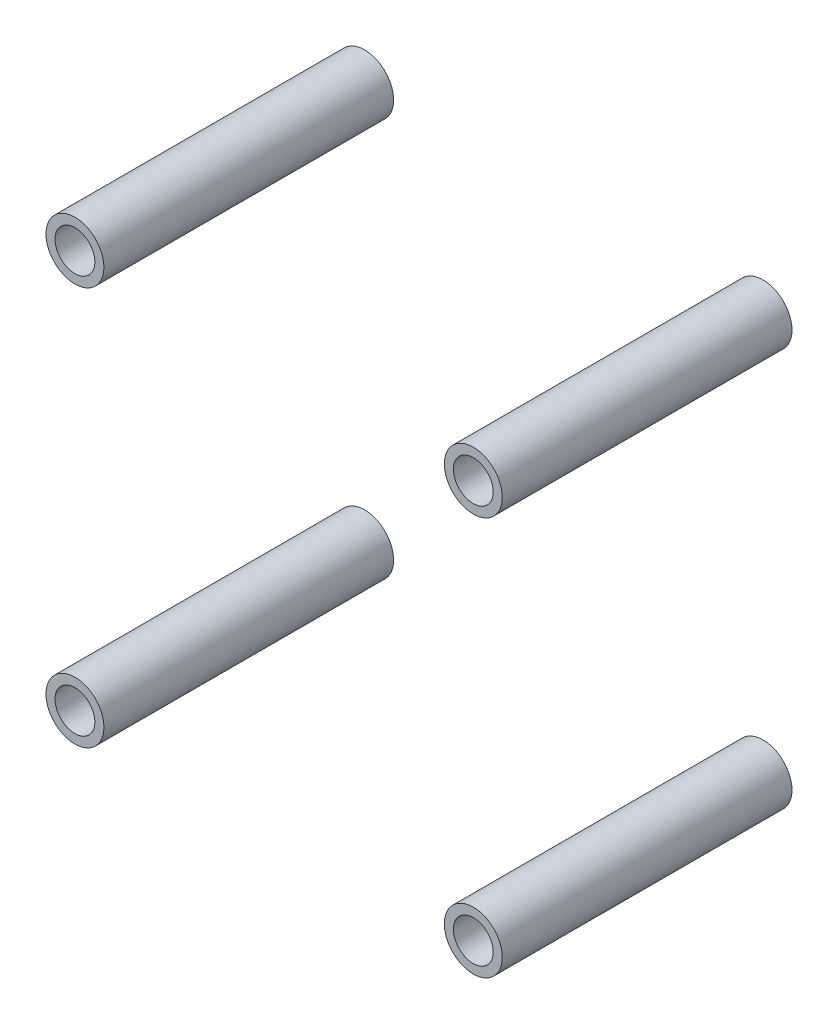
ISO-10303-21;
HEADER;
FILE_DESCRIPTION(('STEP AP214'),'2;1');
FILE_NAME('part.step','',(''),(''),'','','');
FILE_SCHEMA(('AUTOMOTIVE_DESIGN { 1 0 10303 214 1 1 1 1 }'));
ENDSEC;
DATA;
#1=APPLICATION_CONTEXT('core data for automotive mechanical design processes');
#2=APPLICATION_PROTOCOL_DEFINITION('international standard','automotive_design',2000,#1);
#3=PRODUCT_CONTEXT('',#1,'mechanical');
#4=PRODUCT('Part','Part','',(#3));
#5=PRODUCT_RELATED_PRODUCT_CATEGORY('part','',(#4));
#6=PRODUCT_DEFINITION_FORMATION('','',#4);
#7=PRODUCT_DEFINITION_CONTEXT('part definition',#1,'design');
#8=PRODUCT_DEFINITION('design','',#6,#7);
#9=PRODUCT_DEFINITION_SHAPE('','',#8);
#10=(LENGTH_UNIT() NAMED_UNIT(*) SI_UNIT(.MILLI.,.METRE.));
#11=(NAMED_UNIT(*) PLANE_ANGLE_UNIT() SI_UNIT($,.RADIAN.));
#12=(NAMED_UNIT(*) SI_UNIT($,.STERADIAN.) SOLID_ANGLE_UNIT());
#13=UNCERTAINTY_MEASURE_WITH_UNIT(LENGTH_MEASURE(1.E-05),#10,'distance_accuracy_value','');
#14=(GEOMETRIC_REPRESENTATION_CONTEXT(3) GLOBAL_UNCERTAINTY_ASSIGNED_CONTEXT((#13)) GLOBAL_UNIT_ASSIGNED_CONTEXT((#10,
#11,#12)) REPRESENTATION_CONTEXT('',''));
#15=CARTESIAN_POINT('',(0.,0.,0.));
#16=DIRECTION('',(0.,0.,1.));
#17=DIRECTION('',(1.,0.,0.));
#18=AXIS2_PLACEMENT_3D('',#15,#16,#17);
#19=CARTESIAN_POINT('',(27.5,251.9,151.125));
#20=DIRECTION('',(0.,0.,1.));
#21=DIRECTION('',(1.,0.,0.));
#22=AXIS2_PLACEMENT_3D('',#19,#20,#21);
#23=PLANE('',#22);
#24=CARTESIAN_POINT('',(27.5,251.9,151.125));
#25=DIRECTION('',(0.,0.,1.));
#26=DIRECTION('',(1.,0.,0.));
#27=AXIS2_PLACEMENT_3D('',#24,#25,#26);
#28=CIRCLE('',#27,4.);
#29=CARTESIAN_POINT('',(31.5,251.9,151.125));
#30=VERTEX_POINT('',#29);
#31=EDGE_CURVE('E59',#30,#30,#28,.T.);
#32=ORIENTED_EDGE('',*,*,#31,.T.);
#33=EDGE_LOOP('',(#32));
#34=FACE_BOUND('',#33,.T.);
#35=CARTESIAN_POINT('',(27.5,251.9,151.125));
#36=DIRECTION('',(0.,0.,1.));
#37=DIRECTION('',(1.,0.,0.));
#38=AXIS2_PLACEMENT_3D('',#35,#36,#37);
#39=CIRCLE('',#38,2.75);
#40=CARTESIAN_POINT('',(30.25,251.9,151.125));
#41=VERTEX_POINT('',#40);
#42=EDGE_CURVE('E50',#41,#41,#39,.T.);
#43=ORIENTED_EDGE('',*,*,#42,.F.);
#44=EDGE_LOOP('',(#43));
#45=FACE_BOUND('',#44,.T.);
#46=ADVANCED_FACE('F46',(#34,#45),#23,.T.);
#47=CARTESIAN_POINT('',(27.5,251.9,111.125));
#48=DIRECTION('',(0.,0.,1.));
#49=DIRECTION('',(1.,0.,0.));
#50=AXIS2_PLACEMENT_3D('',#47,#48,#49);
#51=PLANE('',#50);
#52=CARTESIAN_POINT('',(27.5,251.9,111.125));
#53=DIRECTION('',(0.,0.,1.));
#54=DIRECTION('',(1.,0.,0.));
#55=AXIS2_PLACEMENT_3D('',#52,#53,#54);
#56=CIRCLE('',#55,4.);
#57=CARTESIAN_POINT('',(31.5,251.9,111.125));
#58=VERTEX_POINT('',#57);
#59=EDGE_CURVE('E57',#58,#58,#56,.T.);
#60=ORIENTED_EDGE('',*,*,#59,.F.);
#61=EDGE_LOOP('',(#60));
#62=FACE_BOUND('',#61,.T.);
#63=CARTESIAN_POINT('',(27.5,251.9,111.125));
#64=DIRECTION('',(0.,0.,1.));
#65=DIRECTION('',(1.,0.,0.));
#66=AXIS2_PLACEMENT_3D('',#63,#64,#65);
#67=CIRCLE('',#66,2.75);
#68=CARTESIAN_POINT('',(30.25,251.9,111.125));
#69=VERTEX_POINT('',#68);
#70=EDGE_CURVE('E11',#69,#69,#67,.T.);
#71=ORIENTED_EDGE('',*,*,#70,.T.);
#72=EDGE_LOOP('',(#71));
#73=FACE_BOUND('',#72,.T.);
#74=ADVANCED_FACE('F67',(#62,#73),#51,.F.);
#75=CARTESIAN_POINT('',(27.5,251.9,151.125));
#76=DIRECTION('',(0.,0.,-1.));
#77=DIRECTION('',(-1.,0.,0.));
#78=AXIS2_PLACEMENT_3D('',#75,#76,#77);
#79=CYLINDRICAL_SURFACE('',#78,4.);
#80=ORIENTED_EDGE('',*,*,#31,.F.);
#81=EDGE_LOOP('',(#80));
#82=FACE_BOUND('',#81,.T.);
#83=ORIENTED_EDGE('',*,*,#59,.T.);
#84=EDGE_LOOP('',(#83));
#85=FACE_BOUND('',#84,.T.);
#86=ADVANCED_FACE('F65',(#82,#85),#79,.T.);
#87=CARTESIAN_POINT('',(27.5,251.9,151.125));
#88=DIRECTION('',(0.,0.,-1.));
#89=DIRECTION('',(-1.,0.,0.));
#90=AXIS2_PLACEMENT_3D('',#87,#88,#89);
#91=CYLINDRICAL_SURFACE('',#90,2.75);
#92=ORIENTED_EDGE('',*,*,#42,.T.);
#93=EDGE_LOOP('',(#92));
#94=FACE_BOUND('',#93,.T.);
#95=ORIENTED_EDGE('',*,*,#70,.F.);
#96=EDGE_LOOP('',(#95));
#97=FACE_BOUND('',#96,.T.);
#98=ADVANCED_FACE('F48',(#94,#97),#91,.F.);
#99=CLOSED_SHELL('',(#46,#74,#86,#98));
#100=MANIFOLD_SOLID_BREP('B2',#99);
#101=CARTESIAN_POINT('',(-27.5,251.9,151.125));
#102=DIRECTION('',(0.,0.,1.));
#103=DIRECTION('',(1.,0.,0.));
#104=AXIS2_PLACEMENT_3D('',#101,#102,#103);
#105=PLANE('',#104);
#106=CARTESIAN_POINT('',(-27.5,251.9,151.125));
#107=DIRECTION('',(0.,0.,1.));
#108=DIRECTION('',(1.,0.,0.));
#109=AXIS2_PLACEMENT_3D('',#106,#107,#108);
#110=CIRCLE('',#109,4.);
#111=CARTESIAN_POINT('',(-23.5,251.9,151.125));
#112=VERTEX_POINT('',#111);
#113=EDGE_CURVE('E129',#112,#112,#110,.T.);
#114=ORIENTED_EDGE('',*,*,#113,.T.);
#115=EDGE_LOOP('',(#114));
#116=FACE_BOUND('',#115,.T.);
#117=CARTESIAN_POINT('',(-27.5,251.9,151.125));
#118=DIRECTION('',(0.,0.,1.));
#119=DIRECTION('',(1.,0.,0.));
#120=AXIS2_PLACEMENT_3D('',#117,#118,#119);
#121=CIRCLE('',#120,2.75);
#122=CARTESIAN_POINT('',(-24.75,251.9,151.125));
#123=VERTEX_POINT('',#122);
#124=EDGE_CURVE('E120',#123,#123,#121,.T.);
#125=ORIENTED_EDGE('',*,*,#124,.F.);
#126=EDGE_LOOP('',(#125));
#127=FACE_BOUND('',#126,.T.);
#128=ADVANCED_FACE('F116',(#116,#127),#105,.T.);
#129=CARTESIAN_POINT('',(-27.5,251.9,111.125));
#130=DIRECTION('',(0.,0.,1.));
#131=DIRECTION('',(1.,0.,0.));
#132=AXIS2_PLACEMENT_3D('',#129,#130,#131);
#133=PLANE('',#132);
#134=CARTESIAN_POINT('',(-27.5,251.9,111.125));
#135=DIRECTION('',(0.,0.,1.));
#136=DIRECTION('',(1.,0.,0.));
#137=AXIS2_PLACEMENT_3D('',#134,#135,#136);
#138=CIRCLE('',#137,4.);
#139=CARTESIAN_POINT('',(-23.5,251.9,111.125));
#140=VERTEX_POINT('',#139);
#141=EDGE_CURVE('E127',#140,#140,#138,.T.);
#142=ORIENTED_EDGE('',*,*,#141,.F.);
#143=EDGE_LOOP('',(#142));
#144=FACE_BOUND('',#143,.T.);
#145=CARTESIAN_POINT('',(-27.5,251.9,111.125));
#146=DIRECTION('',(0.,0.,1.));
#147=DIRECTION('',(1.,0.,0.));
#148=AXIS2_PLACEMENT_3D('',#145,#146,#147);
#149=CIRCLE('',#148,2.75);
#150=CARTESIAN_POINT('',(-24.75,251.9,111.125));
#151=VERTEX_POINT('',#150);
#152=EDGE_CURVE('E45',#151,#151,#149,.T.);
#153=ORIENTED_EDGE('',*,*,#152,.T.);
#154=EDGE_LOOP('',(#153));
#155=FACE_BOUND('',#154,.T.);
#156=ADVANCED_FACE('F137',(#144,#155),#133,.F.);
#157=CARTESIAN_POINT('',(-27.5,251.9,151.125));
#158=DIRECTION('',(0.,0.,-1.));
#159=DIRECTION('',(-1.,0.,0.));
#160=AXIS2_PLACEMENT_3D('',#157,#158,#159);
#161=CYLINDRICAL_SURFACE('',#160,4.);
#162=ORIENTED_EDGE('',*,*,#113,.F.);
#163=EDGE_LOOP('',(#162));
#164=FACE_BOUND('',#163,.T.);
#165=ORIENTED_EDGE('',*,*,#141,.T.);
#166=EDGE_LOOP('',(#165));
#167=FACE_BOUND('',#166,.T.);
#168=ADVANCED_FACE('F135',(#164,#167),#161,.T.);
#169=CARTESIAN_POINT('',(-27.5,251.9,151.125));
#170=DIRECTION('',(0.,0.,-1.));
#171=DIRECTION('',(-1.,0.,0.));
#172=AXIS2_PLACEMENT_3D('',#169,#170,#171);
#173=CYLINDRICAL_SURFACE('',#172,2.75);
#174=ORIENTED_EDGE('',*,*,#124,.T.);
#175=EDGE_LOOP('',(#174));
#176=FACE_BOUND('',#175,.T.);
#177=ORIENTED_EDGE('',*,*,#152,.F.);
#178=EDGE_LOOP('',(#177));
#179=FACE_BOUND('',#178,.T.);
#180=ADVANCED_FACE('F118',(#176,#179),#173,.F.);
#181=CLOSED_SHELL('',(#128,#156,#168,#180));
#182=MANIFOLD_SOLID_BREP('B6',#181);
#183=CARTESIAN_POINT('',(-27.5,306.9,151.125));
#184=DIRECTION('',(0.,0.,1.));
#185=DIRECTION('',(1.,0.,0.));
#186=AXIS2_PLACEMENT_3D('',#183,#184,#185);
#187=PLANE('',#186);
#188=CARTESIAN_POINT('',(-27.5,306.9,151.125));
#189=DIRECTION('',(0.,0.,1.));
#190=DIRECTION('',(1.,0.,0.));
#191=AXIS2_PLACEMENT_3D('',#188,#189,#190);
#192=CIRCLE('',#191,4.);
#193=CARTESIAN_POINT('',(-23.5,306.9,151.125));
#194=VERTEX_POINT('',#193);
#195=EDGE_CURVE('E198',#194,#194,#192,.T.);
#196=ORIENTED_EDGE('',*,*,#195,.T.);
#197=EDGE_LOOP('',(#196));
#198=FACE_BOUND('',#197,.T.);
#199=CARTESIAN_POINT('',(-27.5,306.9,151.125));
#200=DIRECTION('',(0.,0.,1.));
#201=DIRECTION('',(1.,0.,0.));
#202=AXIS2_PLACEMENT_3D('',#199,#200,#201);
#203=CIRCLE('',#202,2.75);
#204=CARTESIAN_POINT('',(-24.75,306.9,151.125));
#205=VERTEX_POINT('',#204);
#206=EDGE_CURVE('E189',#205,#205,#203,.T.);
#207=ORIENTED_EDGE('',*,*,#206,.F.);
#208=EDGE_LOOP('',(#207));
#209=FACE_BOUND('',#208,.T.);
#210=ADVANCED_FACE('F185',(#198,#209),#187,.T.);
#211=CARTESIAN_POINT('',(-27.5,306.9,111.125));
#212=DIRECTION('',(0.,0.,1.));
#213=DIRECTION('',(1.,0.,0.));
#214=AXIS2_PLACEMENT_3D('',#211,#212,#213);
#215=PLANE('',#214);
#216=CARTESIAN_POINT('',(-27.5,306.9,111.125));
#217=DIRECTION('',(0.,0.,1.));
#218=DIRECTION('',(1.,0.,0.));
#219=AXIS2_PLACEMENT_3D('',#216,#217,#218);
#220=CIRCLE('',#219,4.);
#221=CARTESIAN_POINT('',(-23.5,306.9,111.125));
#222=VERTEX_POINT('',#221);
#223=EDGE_CURVE('E196',#222,#222,#220,.T.);
#224=ORIENTED_EDGE('',*,*,#223,.F.);
#225=EDGE_LOOP('',(#224));
#226=FACE_BOUND('',#225,.T.);
#227=CARTESIAN_POINT('',(-27.5,306.9,111.125));
#228=DIRECTION('',(0.,0.,1.));
#229=DIRECTION('',(1.,0.,0.));
#230=AXIS2_PLACEMENT_3D('',#227,#228,#229);
#231=CIRCLE('',#230,2.75);
#232=CARTESIAN_POINT('',(-24.75,306.9,111.125));
#233=VERTEX_POINT('',#232);
#234=EDGE_CURVE('E115',#233,#233,#231,.T.);
#235=ORIENTED_EDGE('',*,*,#234,.T.);
#236=EDGE_LOOP('',(#235));
#237=FACE_BOUND('',#236,.T.);
#238=ADVANCED_FACE('F206',(#226,#237),#215,.F.);
#239=CARTESIAN_POINT('',(-27.5,306.9,151.125));
#240=DIRECTION('',(0.,0.,-1.));
#241=DIRECTION('',(-1.,0.,0.));
#242=AXIS2_PLACEMENT_3D('',#239,#240,#241);
#243=CYLINDRICAL_SURFACE('',#242,4.);
#244=ORIENTED_EDGE('',*,*,#195,.F.);
#245=EDGE_LOOP('',(#244));
#246=FACE_BOUND('',#245,.T.);
#247=ORIENTED_EDGE('',*,*,#223,.T.);
#248=EDGE_LOOP('',(#247));
#249=FACE_BOUND('',#248,.T.);
#250=ADVANCED_FACE('F204',(#246,#249),#243,.T.);
#251=CARTESIAN_POINT('',(-27.5,306.9,151.125));
#252=DIRECTION('',(0.,0.,-1.));
#253=DIRECTION('',(-1.,0.,0.));
#254=AXIS2_PLACEMENT_3D('',#251,#252,#253);
#255=CYLINDRICAL_SURFACE('',#254,2.75);
#256=ORIENTED_EDGE('',*,*,#206,.T.);
#257=EDGE_LOOP('',(#256));
#258=FACE_BOUND('',#257,.T.);
#259=ORIENTED_EDGE('',*,*,#234,.F.);
#260=EDGE_LOOP('',(#259));
#261=FACE_BOUND('',#260,.T.);
#262=ADVANCED_FACE('F187',(#258,#261),#255,.F.);
#263=CLOSED_SHELL('',(#210,#238,#250,#262));
#264=MANIFOLD_SOLID_BREP('B40',#263);
#265=CARTESIAN_POINT('',(27.5,306.9,151.125));
#266=DIRECTION('',(0.,0.,1.));
#267=DIRECTION('',(1.,0.,0.));
#268=AXIS2_PLACEMENT_3D('',#265,#266,#267);
#269=PLANE('',#268);
#270=CARTESIAN_POINT('',(27.5,306.9,151.125));
#271=DIRECTION('',(0.,0.,1.));
#272=DIRECTION('',(1.,0.,0.));
#273=AXIS2_PLACEMENT_3D('',#270,#271,#272);
#274=CIRCLE('',#273,4.);
#275=CARTESIAN_POINT('',(31.5,306.9,151.125));
#276=VERTEX_POINT('',#275);
#277=EDGE_CURVE('E184',#276,#276,#274,.T.);
#278=ORIENTED_EDGE('',*,*,#277,.T.);
#279=EDGE_LOOP('',(#278));
#280=FACE_BOUND('',#279,.T.);
#281=CARTESIAN_POINT('',(27.5,306.9,151.125));
#282=DIRECTION('',(0.,0.,1.));
#283=DIRECTION('',(1.,0.,0.));
#284=AXIS2_PLACEMENT_3D('',#281,#282,#283);
#285=CIRCLE('',#284,2.75);
#286=CARTESIAN_POINT('',(30.25,306.9,151.125));
#287=VERTEX_POINT('',#286);
#288=EDGE_CURVE('E258',#287,#287,#285,.T.);
#289=ORIENTED_EDGE('',*,*,#288,.F.);
#290=EDGE_LOOP('',(#289));
#291=FACE_BOUND('',#290,.T.);
#292=ADVANCED_FACE('F247',(#280,#291),#269,.T.);
#293=CARTESIAN_POINT('',(27.5,306.9,111.125));
#294=DIRECTION('',(0.,0.,1.));
#295=DIRECTION('',(1.,0.,0.));
#296=AXIS2_PLACEMENT_3D('',#293,#294,#295);
#297=PLANE('',#296);
#298=CARTESIAN_POINT('',(27.5,306.9,111.125));
#299=DIRECTION('',(0.,0.,1.));
#300=DIRECTION('',(1.,0.,0.));
#301=AXIS2_PLACEMENT_3D('',#298,#299,#300);
#302=CIRCLE('',#301,4.);
#303=CARTESIAN_POINT('',(31.5,306.9,111.125));
#304=VERTEX_POINT('',#303);
#305=EDGE_CURVE('E251',#304,#304,#302,.T.);
#306=ORIENTED_EDGE('',*,*,#305,.F.);
#307=EDGE_LOOP('',(#306));
#308=FACE_BOUND('',#307,.T.);
#309=CARTESIAN_POINT('',(27.5,306.9,111.125));
#310=DIRECTION('',(0.,0.,1.));
#311=DIRECTION('',(1.,0.,0.));
#312=AXIS2_PLACEMENT_3D('',#309,#310,#311);
#313=CIRCLE('',#312,2.75);
#314=CARTESIAN_POINT('',(30.25,306.9,111.125));
#315=VERTEX_POINT('',#314);
#316=EDGE_CURVE('E260',#315,#315,#313,.T.);
#317=ORIENTED_EDGE('',*,*,#316,.T.);
#318=EDGE_LOOP('',(#317));
#319=FACE_BOUND('',#318,.T.);
#320=ADVANCED_FACE('F270',(#308,#319),#297,.F.);
#321=CARTESIAN_POINT('',(27.5,306.9,151.125));
#322=DIRECTION('',(0.,0.,-1.));
#323=DIRECTION('',(-1.,0.,0.));
#324=AXIS2_PLACEMENT_3D('',#321,#322,#323);
#325=CYLINDRICAL_SURFACE('',#324,4.);
#326=ORIENTED_EDGE('',*,*,#277,.F.);
#327=EDGE_LOOP('',(#326));
#328=FACE_BOUND('',#327,.T.);
#329=ORIENTED_EDGE('',*,*,#305,.T.);
#330=EDGE_LOOP('',(#329));
#331=FACE_BOUND('',#330,.T.);
#332=ADVANCED_FACE('F249',(#328,#331),#325,.T.);
#333=CARTESIAN_POINT('',(27.5,306.9,151.125));
#334=DIRECTION('',(0.,0.,-1.));
#335=DIRECTION('',(-1.,0.,0.));
#336=AXIS2_PLACEMENT_3D('',#333,#334,#335);
#337=CYLINDRICAL_SURFACE('',#336,2.75);
#338=ORIENTED_EDGE('',*,*,#288,.T.);
#339=EDGE_LOOP('',(#338));
#340=FACE_BOUND('',#339,.T.);
#341=ORIENTED_EDGE('',*,*,#316,.F.);
#342=EDGE_LOOP('',(#341));
#343=FACE_BOUND('',#342,.T.);
#344=ADVANCED_FACE('F266',(#340,#343),#337,.F.);
#345=CLOSED_SHELL('',(#292,#320,#332,#344));
#346=MANIFOLD_SOLID_BREP('B110',#345);
#347=ADVANCED_BREP_SHAPE_REPRESENTATION('',(#18,#100,#182,#264,#346),#14);
#348=SHAPE_DEFINITION_REPRESENTATION(#9,#347);
ENDSEC;
END-ISO-10303-21;
